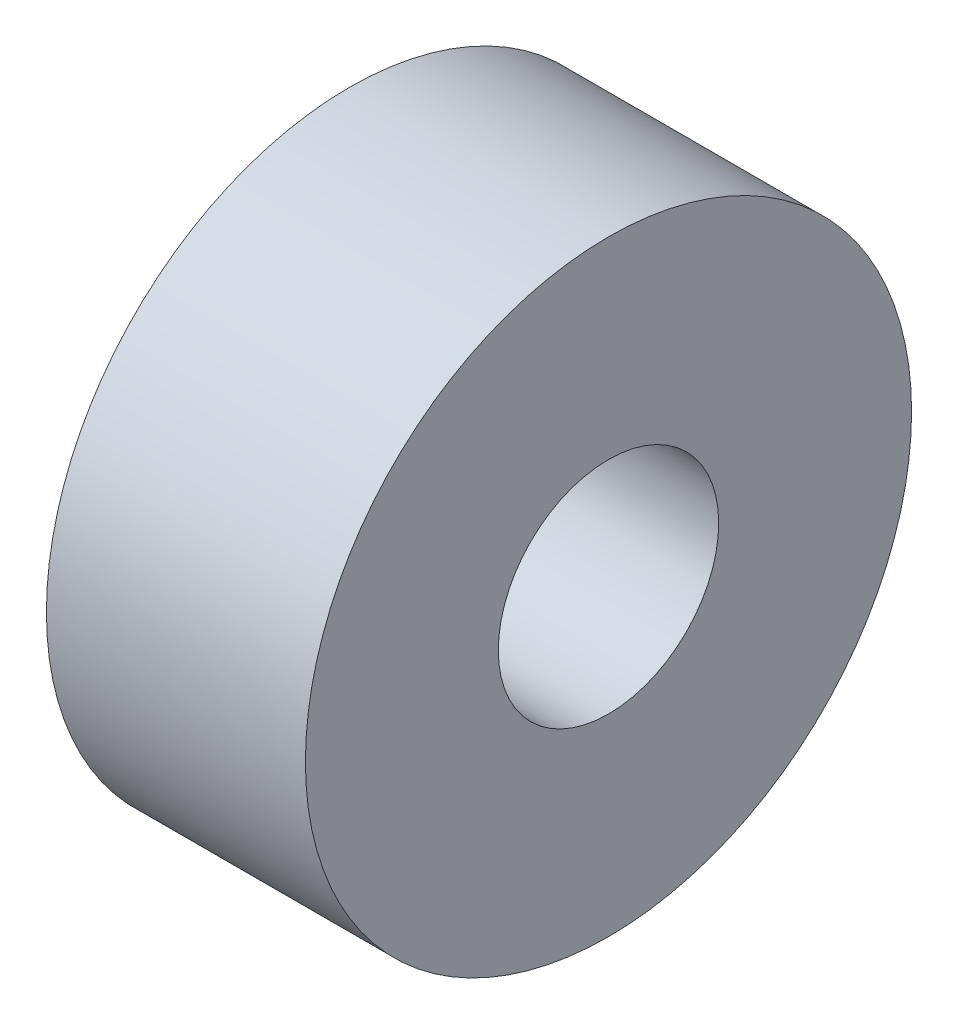
ISO-10303-21;
HEADER;
FILE_DESCRIPTION(('STEP AP214'),'2;1');
FILE_NAME('part.step','',(''),(''),'','','');
FILE_SCHEMA(('AUTOMOTIVE_DESIGN { 1 0 10303 214 1 1 1 1 }'));
ENDSEC;
DATA;
#1=APPLICATION_CONTEXT('core data for automotive mechanical design processes');
#2=APPLICATION_PROTOCOL_DEFINITION('international standard','automotive_design',2000,#1);
#3=PRODUCT_CONTEXT('',#1,'mechanical');
#4=PRODUCT('Part','Part','',(#3));
#5=PRODUCT_RELATED_PRODUCT_CATEGORY('part','',(#4));
#6=PRODUCT_DEFINITION_FORMATION('','',#4);
#7=PRODUCT_DEFINITION_CONTEXT('part definition',#1,'design');
#8=PRODUCT_DEFINITION('design','',#6,#7);
#9=PRODUCT_DEFINITION_SHAPE('','',#8);
#10=(LENGTH_UNIT() NAMED_UNIT(*) SI_UNIT(.MILLI.,.METRE.));
#11=(NAMED_UNIT(*) PLANE_ANGLE_UNIT() SI_UNIT($,.RADIAN.));
#12=(NAMED_UNIT(*) SI_UNIT($,.STERADIAN.) SOLID_ANGLE_UNIT());
#13=UNCERTAINTY_MEASURE_WITH_UNIT(LENGTH_MEASURE(1.E-05),#10,'distance_accuracy_value','');
#14=(GEOMETRIC_REPRESENTATION_CONTEXT(3) GLOBAL_UNCERTAINTY_ASSIGNED_CONTEXT((#13)) GLOBAL_UNIT_ASSIGNED_CONTEXT((#10,
#11,#12)) REPRESENTATION_CONTEXT('',''));
#15=CARTESIAN_POINT('',(0.,0.,0.));
#16=DIRECTION('',(0.,0.,1.));
#17=DIRECTION('',(1.,0.,0.));
#18=AXIS2_PLACEMENT_3D('',#15,#16,#17);
#19=CARTESIAN_POINT('',(2.35,0.,0.));
#20=DIRECTION('',(-1.,0.,0.));
#21=DIRECTION('',(0.,0.,1.));
#22=AXIS2_PLACEMENT_3D('',#19,#20,#21);
#23=CYLINDRICAL_SURFACE('',#22,2.75);
#24=CARTESIAN_POINT('',(2.35,0.,0.));
#25=DIRECTION('',(1.,0.,0.));
#26=DIRECTION('',(0.,0.,-1.));
#27=AXIS2_PLACEMENT_3D('',#24,#25,#26);
#28=CIRCLE('',#27,2.75);
#29=CARTESIAN_POINT('',(2.35,0.,-2.75));
#30=VERTEX_POINT('',#29);
#31=EDGE_CURVE('E10',#30,#30,#28,.T.);
#32=ORIENTED_EDGE('',*,*,#31,.F.);
#33=EDGE_LOOP('',(#32));
#34=FACE_BOUND('',#33,.T.);
#35=CARTESIAN_POINT('',(0.,0.,0.));
#36=DIRECTION('',(1.,0.,0.));
#37=DIRECTION('',(0.,0.,-1.));
#38=AXIS2_PLACEMENT_3D('',#35,#36,#37);
#39=CIRCLE('',#38,2.75);
#40=CARTESIAN_POINT('',(0.,0.,-2.75));
#41=VERTEX_POINT('',#40);
#42=EDGE_CURVE('E36',#41,#41,#39,.T.);
#43=ORIENTED_EDGE('',*,*,#42,.T.);
#44=EDGE_LOOP('',(#43));
#45=FACE_BOUND('',#44,.T.);
#46=ADVANCED_FACE('F33',(#34,#45),#23,.T.);
#47=CARTESIAN_POINT('',(2.35,0.,0.));
#48=DIRECTION('',(1.,0.,0.));
#49=DIRECTION('',(0.,0.,-1.));
#50=AXIS2_PLACEMENT_3D('',#47,#48,#49);
#51=PLANE('',#50);
#52=CARTESIAN_POINT('',(2.35,0.,0.));
#53=DIRECTION('',(1.,0.,0.));
#54=DIRECTION('',(0.,0.,-1.));
#55=AXIS2_PLACEMENT_3D('',#52,#53,#54);
#56=CIRCLE('',#55,1.);
#57=CARTESIAN_POINT('',(2.35,0.,-1.));
#58=VERTEX_POINT('',#57);
#59=EDGE_CURVE('E45',#58,#58,#56,.T.);
#60=ORIENTED_EDGE('',*,*,#59,.F.);
#61=EDGE_LOOP('',(#60));
#62=FACE_BOUND('',#61,.T.);
#63=ORIENTED_EDGE('',*,*,#31,.T.);
#64=EDGE_LOOP('',(#63));
#65=FACE_BOUND('',#64,.T.);
#66=ADVANCED_FACE('F60',(#62,#65),#51,.T.);
#67=CARTESIAN_POINT('',(0.,0.,0.));
#68=DIRECTION('',(1.,0.,0.));
#69=DIRECTION('',(0.,0.,-1.));
#70=AXIS2_PLACEMENT_3D('',#67,#68,#69);
#71=PLANE('',#70);
#72=CARTESIAN_POINT('',(0.,0.,0.));
#73=DIRECTION('',(1.,0.,0.));
#74=DIRECTION('',(0.,0.,-1.));
#75=AXIS2_PLACEMENT_3D('',#72,#73,#74);
#76=CIRCLE('',#75,1.);
#77=CARTESIAN_POINT('',(0.,0.,-1.));
#78=VERTEX_POINT('',#77);
#79=EDGE_CURVE('E43',#78,#78,#76,.T.);
#80=ORIENTED_EDGE('',*,*,#79,.T.);
#81=EDGE_LOOP('',(#80));
#82=FACE_BOUND('',#81,.T.);
#83=ORIENTED_EDGE('',*,*,#42,.F.);
#84=EDGE_LOOP('',(#83));
#85=FACE_BOUND('',#84,.T.);
#86=ADVANCED_FACE('F51',(#82,#85),#71,.F.);
#87=CARTESIAN_POINT('',(0.,0.,0.));
#88=DIRECTION('',(1.,0.,0.));
#89=DIRECTION('',(0.,0.,-1.));
#90=AXIS2_PLACEMENT_3D('',#87,#88,#89);
#91=CYLINDRICAL_SURFACE('',#90,1.);
#92=ORIENTED_EDGE('',*,*,#79,.F.);
#93=EDGE_LOOP('',(#92));
#94=FACE_BOUND('',#93,.T.);
#95=ORIENTED_EDGE('',*,*,#59,.T.);
#96=EDGE_LOOP('',(#95));
#97=FACE_BOUND('',#96,.T.);
#98=ADVANCED_FACE('F54',(#94,#97),#91,.F.);
#99=CLOSED_SHELL('',(#46,#66,#86,#98));
#100=MANIFOLD_SOLID_BREP('B2',#99);
#101=ADVANCED_BREP_SHAPE_REPRESENTATION('',(#18,#100),#14);
#102=SHAPE_DEFINITION_REPRESENTATION(#9,#101);
ENDSEC;
END-ISO-10303-21;
